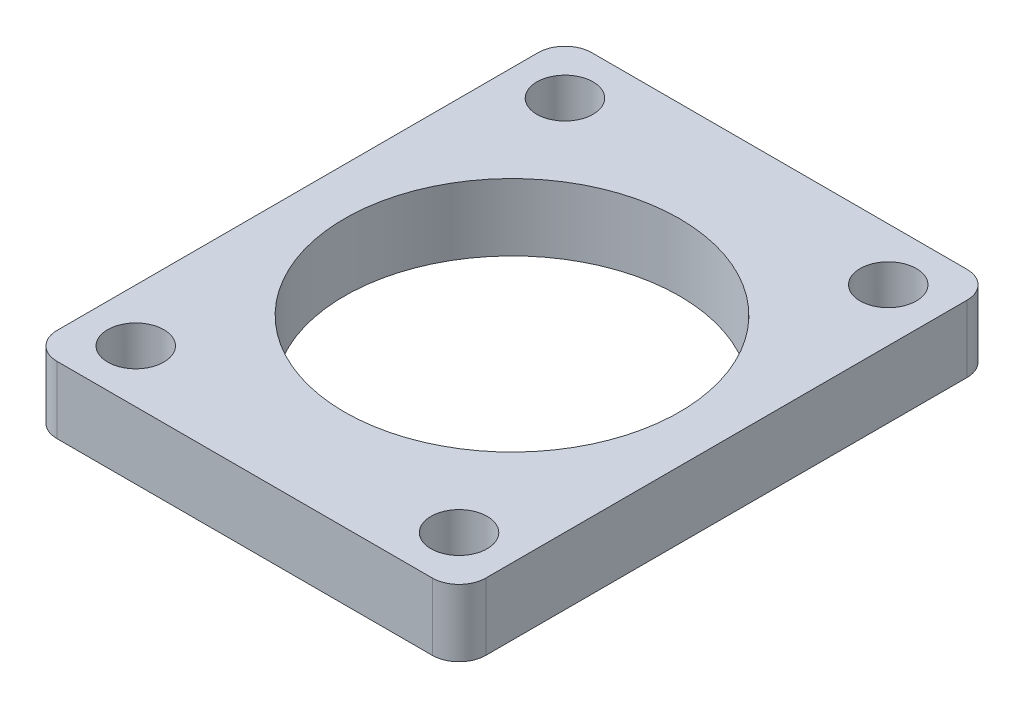
ISO-10303-21;
HEADER;
FILE_DESCRIPTION(('STEP AP214'),'2;1');
FILE_NAME('part.step','',(''),(''),'','','');
FILE_SCHEMA(('AUTOMOTIVE_DESIGN { 1 0 10303 214 1 1 1 1 }'));
ENDSEC;
DATA;
#1=APPLICATION_CONTEXT('core data for automotive mechanical design processes');
#2=APPLICATION_PROTOCOL_DEFINITION('international standard','automotive_design',2000,#1);
#3=PRODUCT_CONTEXT('',#1,'mechanical');
#4=PRODUCT('Part','Part','',(#3));
#5=PRODUCT_RELATED_PRODUCT_CATEGORY('part','',(#4));
#6=PRODUCT_DEFINITION_FORMATION('','',#4);
#7=PRODUCT_DEFINITION_CONTEXT('part definition',#1,'design');
#8=PRODUCT_DEFINITION('design','',#6,#7);
#9=PRODUCT_DEFINITION_SHAPE('','',#8);
#10=(LENGTH_UNIT() NAMED_UNIT(*) SI_UNIT(.MILLI.,.METRE.));
#11=(NAMED_UNIT(*) PLANE_ANGLE_UNIT() SI_UNIT($,.RADIAN.));
#12=(NAMED_UNIT(*) SI_UNIT($,.STERADIAN.) SOLID_ANGLE_UNIT());
#13=UNCERTAINTY_MEASURE_WITH_UNIT(LENGTH_MEASURE(1.E-05),#10,'distance_accuracy_value','');
#14=(GEOMETRIC_REPRESENTATION_CONTEXT(3) GLOBAL_UNCERTAINTY_ASSIGNED_CONTEXT((#13)) GLOBAL_UNIT_ASSIGNED_CONTEXT((#10,
#11,#12)) REPRESENTATION_CONTEXT('',''));
#15=CARTESIAN_POINT('',(0.,0.,0.));
#16=DIRECTION('',(0.,0.,1.));
#17=DIRECTION('',(1.,0.,0.));
#18=AXIS2_PLACEMENT_3D('',#15,#16,#17);
#19=CARTESIAN_POINT('',(0.,6.35000000000002,0.));
#20=DIRECTION('',(0.,1.,0.));
#21=DIRECTION('',(0.,0.,1.));
#22=AXIS2_PLACEMENT_3D('',#19,#20,#21);
#23=PLANE('',#22);
#24=CARTESIAN_POINT('',(-15.32,6.35000000000002,20.3365));
#25=DIRECTION('',(0.,1.,0.));
#26=DIRECTION('',(0.,0.,-1.));
#27=AXIS2_PLACEMENT_3D('',#24,#25,#26);
#28=CIRCLE('',#27,2.665);
#29=CARTESIAN_POINT('',(-15.32,6.35000000000002,17.6715));
#30=VERTEX_POINT('',#29);
#31=EDGE_CURVE('E210',#30,#30,#28,.T.);
#32=ORIENTED_EDGE('',*,*,#31,.F.);
#33=EDGE_LOOP('',(#32));
#34=FACE_BOUND('',#33,.T.);
#35=CARTESIAN_POINT('',(15.32,6.35000000000002,20.3365));
#36=DIRECTION('',(0.,1.,0.));
#37=DIRECTION('',(0.,0.,1.));
#38=AXIS2_PLACEMENT_3D('',#35,#36,#37);
#39=CIRCLE('',#38,2.665);
#40=CARTESIAN_POINT('',(15.32,6.35000000000002,23.0015));
#41=VERTEX_POINT('',#40);
#42=EDGE_CURVE('E209',#41,#41,#39,.T.);
#43=ORIENTED_EDGE('',*,*,#42,.F.);
#44=EDGE_LOOP('',(#43));
#45=FACE_BOUND('',#44,.T.);
#46=CARTESIAN_POINT('',(15.32,6.35000000000002,-20.3365));
#47=DIRECTION('',(0.,1.,0.));
#48=DIRECTION('',(0.,0.,-1.));
#49=AXIS2_PLACEMENT_3D('',#46,#47,#48);
#50=CIRCLE('',#49,2.665);
#51=CARTESIAN_POINT('',(15.32,6.35000000000002,-23.0015));
#52=VERTEX_POINT('',#51);
#53=EDGE_CURVE('E216',#52,#52,#50,.T.);
#54=ORIENTED_EDGE('',*,*,#53,.F.);
#55=EDGE_LOOP('',(#54));
#56=FACE_BOUND('',#55,.T.);
#57=CARTESIAN_POINT('',(-15.32,6.35000000000002,-20.3365));
#58=DIRECTION('',(0.,1.,0.));
#59=DIRECTION('',(0.,0.,1.));
#60=AXIS2_PLACEMENT_3D('',#57,#58,#59);
#61=CIRCLE('',#60,2.665);
#62=CARTESIAN_POINT('',(-15.32,6.35000000000002,-17.6715));
#63=VERTEX_POINT('',#62);
#64=EDGE_CURVE('E202',#63,#63,#61,.T.);
#65=ORIENTED_EDGE('',*,*,#64,.F.);
#66=EDGE_LOOP('',(#65));
#67=FACE_BOUND('',#66,.T.);
#68=DIRECTION('',(0.,0.,-1.));
#69=VECTOR('',#68,1.);
#70=CARTESIAN_POINT('',(20.32,6.35000000000002,-25.3365));
#71=LINE('',#70,#69);
#72=CARTESIAN_POINT('',(20.32,6.35000000000002,22.7965));
#73=VERTEX_POINT('',#72);
#74=CARTESIAN_POINT('',(20.32,6.35000000000002,-22.7965));
#75=VERTEX_POINT('',#74);
#76=EDGE_CURVE('E149',#73,#75,#71,.T.);
#77=ORIENTED_EDGE('',*,*,#76,.T.);
#78=CARTESIAN_POINT('',(17.78,6.35000000000002,-22.7965));
#79=DIRECTION('',(0.,1.,0.));
#80=DIRECTION('',(0.,0.,1.));
#81=AXIS2_PLACEMENT_3D('',#78,#79,#80);
#82=CIRCLE('',#81,2.54);
#83=CARTESIAN_POINT('',(17.78,6.35000000000002,-25.3365));
#84=VERTEX_POINT('',#83);
#85=EDGE_CURVE('E164',#75,#84,#82,.T.);
#86=ORIENTED_EDGE('',*,*,#85,.T.);
#87=DIRECTION('',(-1.,0.,0.));
#88=VECTOR('',#87,1.);
#89=CARTESIAN_POINT('',(-20.32,6.35000000000002,-25.3365));
#90=LINE('',#89,#88);
#91=CARTESIAN_POINT('',(-17.78,6.35000000000002,-25.3365));
#92=VERTEX_POINT('',#91);
#93=EDGE_CURVE('E131',#84,#92,#90,.T.);
#94=ORIENTED_EDGE('',*,*,#93,.T.);
#95=CARTESIAN_POINT('',(-17.78,6.35000000000002,-22.7965));
#96=DIRECTION('',(0.,1.,0.));
#97=DIRECTION('',(0.,0.,1.));
#98=AXIS2_PLACEMENT_3D('',#95,#96,#97);
#99=CIRCLE('',#98,2.54);
#100=CARTESIAN_POINT('',(-20.32,6.35000000000002,-22.7965));
#101=VERTEX_POINT('',#100);
#102=EDGE_CURVE('E162',#92,#101,#99,.T.);
#103=ORIENTED_EDGE('',*,*,#102,.T.);
#104=DIRECTION('',(0.,0.,1.));
#105=VECTOR('',#104,1.);
#106=CARTESIAN_POINT('',(-20.32,6.35000000000002,-25.3365));
#107=LINE('',#106,#105);
#108=CARTESIAN_POINT('',(-20.32,6.35000000000002,22.7965));
#109=VERTEX_POINT('',#108);
#110=EDGE_CURVE('E184',#101,#109,#107,.T.);
#111=ORIENTED_EDGE('',*,*,#110,.T.);
#112=CARTESIAN_POINT('',(-17.78,6.35000000000002,22.7965));
#113=DIRECTION('',(0.,1.,0.));
#114=DIRECTION('',(0.,0.,1.));
#115=AXIS2_PLACEMENT_3D('',#112,#113,#114);
#116=CIRCLE('',#115,2.54);
#117=CARTESIAN_POINT('',(-17.78,6.35000000000002,25.3365));
#118=VERTEX_POINT('',#117);
#119=EDGE_CURVE('E66',#109,#118,#116,.T.);
#120=ORIENTED_EDGE('',*,*,#119,.T.);
#121=DIRECTION('',(1.,0.,0.));
#122=VECTOR('',#121,1.);
#123=CARTESIAN_POINT('',(-20.32,6.35000000000002,25.3365));
#124=LINE('',#123,#122);
#125=CARTESIAN_POINT('',(17.78,6.35000000000002,25.3365));
#126=VERTEX_POINT('',#125);
#127=EDGE_CURVE('E150',#118,#126,#124,.T.);
#128=ORIENTED_EDGE('',*,*,#127,.T.);
#129=CARTESIAN_POINT('',(17.78,6.35000000000002,22.7965));
#130=DIRECTION('',(0.,1.,0.));
#131=DIRECTION('',(0.,0.,1.));
#132=AXIS2_PLACEMENT_3D('',#129,#130,#131);
#133=CIRCLE('',#132,2.54);
#134=EDGE_CURVE('E160',#126,#73,#133,.T.);
#135=ORIENTED_EDGE('',*,*,#134,.T.);
#136=EDGE_LOOP('',(#77,#86,#94,#103,#111,#120,#128,#135));
#137=FACE_BOUND('',#136,.T.);
#138=CARTESIAN_POINT('',(0.,6.35000000000002,0.));
#139=DIRECTION('',(0.,1.,0.));
#140=DIRECTION('',(0.,0.,1.));
#141=AXIS2_PLACEMENT_3D('',#138,#139,#140);
#142=CIRCLE('',#141,15.875);
#143=CARTESIAN_POINT('',(0.,6.35000000000002,15.875));
#144=VERTEX_POINT('',#143);
#145=EDGE_CURVE('E144',#144,#144,#142,.T.);
#146=ORIENTED_EDGE('',*,*,#145,.F.);
#147=EDGE_LOOP('',(#146));
#148=FACE_BOUND('',#147,.T.);
#149=ADVANCED_FACE('F46',(#34,#45,#56,#67,#137,#148),#23,.T.);
#150=CARTESIAN_POINT('',(0.,0.,0.));
#151=DIRECTION('',(0.,1.,0.));
#152=DIRECTION('',(0.,0.,1.));
#153=AXIS2_PLACEMENT_3D('',#150,#151,#152);
#154=PLANE('',#153);
#155=CARTESIAN_POINT('',(-15.32,0.,20.3365));
#156=DIRECTION('',(0.,1.,0.));
#157=DIRECTION('',(0.,0.,1.));
#158=AXIS2_PLACEMENT_3D('',#155,#156,#157);
#159=CIRCLE('',#158,2.665);
#160=CARTESIAN_POINT('',(-15.32,0.,23.0015));
#161=VERTEX_POINT('',#160);
#162=EDGE_CURVE('E206',#161,#161,#159,.F.);
#163=ORIENTED_EDGE('',*,*,#162,.F.);
#164=EDGE_LOOP('',(#163));
#165=FACE_BOUND('',#164,.T.);
#166=CARTESIAN_POINT('',(15.32,0.,20.3365));
#167=DIRECTION('',(0.,1.,0.));
#168=DIRECTION('',(0.,0.,1.));
#169=AXIS2_PLACEMENT_3D('',#166,#167,#168);
#170=CIRCLE('',#169,2.665);
#171=CARTESIAN_POINT('',(15.32,0.,23.0015));
#172=VERTEX_POINT('',#171);
#173=EDGE_CURVE('E213',#172,#172,#170,.F.);
#174=ORIENTED_EDGE('',*,*,#173,.F.);
#175=EDGE_LOOP('',(#174));
#176=FACE_BOUND('',#175,.T.);
#177=CARTESIAN_POINT('',(15.32,0.,-20.3365));
#178=DIRECTION('',(0.,1.,0.));
#179=DIRECTION('',(0.,0.,1.));
#180=AXIS2_PLACEMENT_3D('',#177,#178,#179);
#181=CIRCLE('',#180,2.665);
#182=CARTESIAN_POINT('',(15.32,0.,-17.6715));
#183=VERTEX_POINT('',#182);
#184=EDGE_CURVE('E205',#183,#183,#181,.F.);
#185=ORIENTED_EDGE('',*,*,#184,.F.);
#186=EDGE_LOOP('',(#185));
#187=FACE_BOUND('',#186,.T.);
#188=CARTESIAN_POINT('',(-15.32,0.,-20.3365));
#189=DIRECTION('',(0.,1.,0.));
#190=DIRECTION('',(0.,0.,1.));
#191=AXIS2_PLACEMENT_3D('',#188,#189,#190);
#192=CIRCLE('',#191,2.665);
#193=CARTESIAN_POINT('',(-15.32,0.,-17.6715));
#194=VERTEX_POINT('',#193);
#195=EDGE_CURVE('E198',#194,#194,#192,.F.);
#196=ORIENTED_EDGE('',*,*,#195,.F.);
#197=EDGE_LOOP('',(#196));
#198=FACE_BOUND('',#197,.T.);
#199=DIRECTION('',(-1.,0.,0.));
#200=VECTOR('',#199,1.);
#201=CARTESIAN_POINT('',(-20.32,0.,-25.3365));
#202=LINE('',#201,#200);
#203=CARTESIAN_POINT('',(17.78,0.,-25.3365));
#204=VERTEX_POINT('',#203);
#205=CARTESIAN_POINT('',(-17.78,0.,-25.3365));
#206=VERTEX_POINT('',#205);
#207=EDGE_CURVE('E128',#204,#206,#202,.T.);
#208=ORIENTED_EDGE('',*,*,#207,.F.);
#209=CARTESIAN_POINT('',(17.78,0.,-22.7965));
#210=DIRECTION('',(0.,1.,0.));
#211=DIRECTION('',(0.,0.,1.));
#212=AXIS2_PLACEMENT_3D('',#209,#210,#211);
#213=CIRCLE('',#212,2.54);
#214=CARTESIAN_POINT('',(20.32,0.,-22.7965));
#215=VERTEX_POINT('',#214);
#216=EDGE_CURVE('E111',#204,#215,#213,.F.);
#217=ORIENTED_EDGE('',*,*,#216,.T.);
#218=DIRECTION('',(0.,0.,-1.));
#219=VECTOR('',#218,1.);
#220=CARTESIAN_POINT('',(20.32,0.,-25.3365));
#221=LINE('',#220,#219);
#222=CARTESIAN_POINT('',(20.32,0.,22.7965));
#223=VERTEX_POINT('',#222);
#224=EDGE_CURVE('E139',#223,#215,#221,.T.);
#225=ORIENTED_EDGE('',*,*,#224,.F.);
#226=CARTESIAN_POINT('',(17.78,0.,22.7965));
#227=DIRECTION('',(0.,1.,0.));
#228=DIRECTION('',(0.,0.,1.));
#229=AXIS2_PLACEMENT_3D('',#226,#227,#228);
#230=CIRCLE('',#229,2.54);
#231=CARTESIAN_POINT('',(17.78,0.,25.3365));
#232=VERTEX_POINT('',#231);
#233=EDGE_CURVE('E153',#223,#232,#230,.F.);
#234=ORIENTED_EDGE('',*,*,#233,.T.);
#235=DIRECTION('',(1.,0.,0.));
#236=VECTOR('',#235,1.);
#237=CARTESIAN_POINT('',(-20.32,0.,25.3365));
#238=LINE('',#237,#236);
#239=CARTESIAN_POINT('',(-17.78,0.,25.3365));
#240=VERTEX_POINT('',#239);
#241=EDGE_CURVE('E142',#240,#232,#238,.T.);
#242=ORIENTED_EDGE('',*,*,#241,.F.);
#243=CARTESIAN_POINT('',(-17.78,0.,22.7965));
#244=DIRECTION('',(0.,1.,0.));
#245=DIRECTION('',(0.,0.,1.));
#246=AXIS2_PLACEMENT_3D('',#243,#244,#245);
#247=CIRCLE('',#246,2.54);
#248=CARTESIAN_POINT('',(-20.32,0.,22.7965));
#249=VERTEX_POINT('',#248);
#250=EDGE_CURVE('E132',#240,#249,#247,.F.);
#251=ORIENTED_EDGE('',*,*,#250,.T.);
#252=DIRECTION('',(0.,0.,1.));
#253=VECTOR('',#252,1.);
#254=CARTESIAN_POINT('',(-20.32,0.,-25.3365));
#255=LINE('',#254,#253);
#256=CARTESIAN_POINT('',(-20.32,0.,-22.7965));
#257=VERTEX_POINT('',#256);
#258=EDGE_CURVE('E138',#257,#249,#255,.T.);
#259=ORIENTED_EDGE('',*,*,#258,.F.);
#260=CARTESIAN_POINT('',(-17.78,0.,-22.7965));
#261=DIRECTION('',(0.,1.,0.));
#262=DIRECTION('',(0.,0.,1.));
#263=AXIS2_PLACEMENT_3D('',#260,#261,#262);
#264=CIRCLE('',#263,2.54);
#265=EDGE_CURVE('E122',#257,#206,#264,.F.);
#266=ORIENTED_EDGE('',*,*,#265,.T.);
#267=EDGE_LOOP('',(#208,#217,#225,#234,#242,#251,#259,#266));
#268=FACE_BOUND('',#267,.T.);
#269=CARTESIAN_POINT('',(0.,0.,0.));
#270=DIRECTION('',(0.,1.,0.));
#271=DIRECTION('',(0.,0.,1.));
#272=AXIS2_PLACEMENT_3D('',#269,#270,#271);
#273=CIRCLE('',#272,15.875);
#274=CARTESIAN_POINT('',(0.,0.,15.875));
#275=VERTEX_POINT('',#274);
#276=EDGE_CURVE('E187',#275,#275,#273,.T.);
#277=ORIENTED_EDGE('',*,*,#276,.T.);
#278=EDGE_LOOP('',(#277));
#279=FACE_BOUND('',#278,.T.);
#280=ADVANCED_FACE('F135',(#165,#176,#187,#198,#268,#279),#154,.F.);
#281=CARTESIAN_POINT('',(20.32,6.35000000000002,-25.3365));
#282=DIRECTION('',(-1.,0.,0.));
#283=DIRECTION('',(0.,0.,1.));
#284=AXIS2_PLACEMENT_3D('',#281,#282,#283);
#285=PLANE('',#284);
#286=ORIENTED_EDGE('',*,*,#224,.T.);
#287=DIRECTION('',(0.,-1.,0.));
#288=VECTOR('',#287,1.);
#289=CARTESIAN_POINT('',(20.32,6.35000000000002,-22.7965));
#290=LINE('',#289,#288);
#291=EDGE_CURVE('E116',#215,#75,#290,.F.);
#292=ORIENTED_EDGE('',*,*,#291,.T.);
#293=ORIENTED_EDGE('',*,*,#76,.F.);
#294=DIRECTION('',(0.,-1.,0.));
#295=VECTOR('',#294,1.);
#296=CARTESIAN_POINT('',(20.32,6.35000000000002,22.7965));
#297=LINE('',#296,#295);
#298=EDGE_CURVE('E121',#73,#223,#297,.T.);
#299=ORIENTED_EDGE('',*,*,#298,.T.);
#300=EDGE_LOOP('',(#286,#292,#293,#299));
#301=FACE_BOUND('',#300,.T.);
#302=ADVANCED_FACE('F181',(#301),#285,.F.);
#303=CARTESIAN_POINT('',(-20.32,6.35000000000002,-25.3365));
#304=DIRECTION('',(0.,0.,1.));
#305=DIRECTION('',(1.,0.,0.));
#306=AXIS2_PLACEMENT_3D('',#303,#304,#305);
#307=PLANE('',#306);
#308=ORIENTED_EDGE('',*,*,#93,.F.);
#309=DIRECTION('',(0.,-1.,0.));
#310=VECTOR('',#309,1.);
#311=CARTESIAN_POINT('',(17.78,6.35000000000002,-25.3365));
#312=LINE('',#311,#310);
#313=EDGE_CURVE('E115',#84,#204,#312,.T.);
#314=ORIENTED_EDGE('',*,*,#313,.T.);
#315=ORIENTED_EDGE('',*,*,#207,.T.);
#316=DIRECTION('',(0.,-1.,0.));
#317=VECTOR('',#316,1.);
#318=CARTESIAN_POINT('',(-17.78,6.35000000000002,-25.3365));
#319=LINE('',#318,#317);
#320=EDGE_CURVE('E133',#206,#92,#319,.F.);
#321=ORIENTED_EDGE('',*,*,#320,.T.);
#322=EDGE_LOOP('',(#308,#314,#315,#321));
#323=FACE_BOUND('',#322,.T.);
#324=ADVANCED_FACE('F127',(#323),#307,.F.);
#325=CARTESIAN_POINT('',(-20.32,6.35000000000002,-25.3365));
#326=DIRECTION('',(1.,0.,0.));
#327=DIRECTION('',(0.,0.,-1.));
#328=AXIS2_PLACEMENT_3D('',#325,#326,#327);
#329=PLANE('',#328);
#330=ORIENTED_EDGE('',*,*,#110,.F.);
#331=DIRECTION('',(0.,-1.,0.));
#332=VECTOR('',#331,1.);
#333=CARTESIAN_POINT('',(-20.32,6.35000000000002,-22.7965));
#334=LINE('',#333,#332);
#335=EDGE_CURVE('E168',#101,#257,#334,.T.);
#336=ORIENTED_EDGE('',*,*,#335,.T.);
#337=ORIENTED_EDGE('',*,*,#258,.T.);
#338=DIRECTION('',(0.,-1.,0.));
#339=VECTOR('',#338,1.);
#340=CARTESIAN_POINT('',(-20.32,6.35000000000002,22.7965));
#341=LINE('',#340,#339);
#342=EDGE_CURVE('E166',#249,#109,#341,.F.);
#343=ORIENTED_EDGE('',*,*,#342,.T.);
#344=EDGE_LOOP('',(#330,#336,#337,#343));
#345=FACE_BOUND('',#344,.T.);
#346=ADVANCED_FACE('F250',(#345),#329,.F.);
#347=CARTESIAN_POINT('',(-20.32,6.35000000000002,25.3365));
#348=DIRECTION('',(0.,0.,-1.));
#349=DIRECTION('',(-1.,0.,0.));
#350=AXIS2_PLACEMENT_3D('',#347,#348,#349);
#351=PLANE('',#350);
#352=ORIENTED_EDGE('',*,*,#241,.T.);
#353=DIRECTION('',(0.,-1.,0.));
#354=VECTOR('',#353,1.);
#355=CARTESIAN_POINT('',(17.78,6.35000000000002,25.3365));
#356=LINE('',#355,#354);
#357=EDGE_CURVE('E13',#232,#126,#356,.F.);
#358=ORIENTED_EDGE('',*,*,#357,.T.);
#359=ORIENTED_EDGE('',*,*,#127,.F.);
#360=DIRECTION('',(0.,-1.,0.));
#361=VECTOR('',#360,1.);
#362=CARTESIAN_POINT('',(-17.78,6.35000000000002,25.3365));
#363=LINE('',#362,#361);
#364=EDGE_CURVE('E54',#118,#240,#363,.T.);
#365=ORIENTED_EDGE('',*,*,#364,.T.);
#366=EDGE_LOOP('',(#352,#358,#359,#365));
#367=FACE_BOUND('',#366,.T.);
#368=ADVANCED_FACE('F173',(#367),#351,.F.);
#369=CARTESIAN_POINT('',(0.,6.35000000000002,0.));
#370=DIRECTION('',(0.,-1.,0.));
#371=DIRECTION('',(0.,0.,-1.));
#372=AXIS2_PLACEMENT_3D('',#369,#370,#371);
#373=CYLINDRICAL_SURFACE('',#372,15.875);
#374=ORIENTED_EDGE('',*,*,#145,.T.);
#375=EDGE_LOOP('',(#374));
#376=FACE_BOUND('',#375,.T.);
#377=ORIENTED_EDGE('',*,*,#276,.F.);
#378=EDGE_LOOP('',(#377));
#379=FACE_BOUND('',#378,.T.);
#380=ADVANCED_FACE('F233',(#376,#379),#373,.F.);
#381=CARTESIAN_POINT('',(-15.32,-0.000999999999973245,-20.3365));
#382=DIRECTION('',(0.,1.,0.));
#383=DIRECTION('',(0.,0.,1.));
#384=AXIS2_PLACEMENT_3D('',#381,#382,#383);
#385=CYLINDRICAL_SURFACE('',#384,2.665);
#386=ORIENTED_EDGE('',*,*,#64,.T.);
#387=EDGE_LOOP('',(#386));
#388=FACE_BOUND('',#387,.T.);
#389=ORIENTED_EDGE('',*,*,#195,.T.);
#390=EDGE_LOOP('',(#389));
#391=FACE_BOUND('',#390,.T.);
#392=ADVANCED_FACE('F230',(#388,#391),#385,.F.);
#393=CARTESIAN_POINT('',(15.32,-0.000999999999973245,-20.3365));
#394=DIRECTION('',(0.,1.,0.));
#395=DIRECTION('',(0.,0.,1.));
#396=AXIS2_PLACEMENT_3D('',#393,#394,#395);
#397=CYLINDRICAL_SURFACE('',#396,2.665);
#398=ORIENTED_EDGE('',*,*,#53,.T.);
#399=EDGE_LOOP('',(#398));
#400=FACE_BOUND('',#399,.T.);
#401=ORIENTED_EDGE('',*,*,#184,.T.);
#402=EDGE_LOOP('',(#401));
#403=FACE_BOUND('',#402,.T.);
#404=ADVANCED_FACE('F224',(#400,#403),#397,.F.);
#405=CARTESIAN_POINT('',(15.32,-0.000999999999973245,20.3365));
#406=DIRECTION('',(0.,1.,0.));
#407=DIRECTION('',(0.,0.,1.));
#408=AXIS2_PLACEMENT_3D('',#405,#406,#407);
#409=CYLINDRICAL_SURFACE('',#408,2.665);
#410=ORIENTED_EDGE('',*,*,#42,.T.);
#411=EDGE_LOOP('',(#410));
#412=FACE_BOUND('',#411,.T.);
#413=ORIENTED_EDGE('',*,*,#173,.T.);
#414=EDGE_LOOP('',(#413));
#415=FACE_BOUND('',#414,.T.);
#416=ADVANCED_FACE('F297',(#412,#415),#409,.F.);
#417=CARTESIAN_POINT('',(-15.32,-0.000999999999973245,20.3365));
#418=DIRECTION('',(0.,1.,0.));
#419=DIRECTION('',(0.,0.,1.));
#420=AXIS2_PLACEMENT_3D('',#417,#418,#419);
#421=CYLINDRICAL_SURFACE('',#420,2.665);
#422=ORIENTED_EDGE('',*,*,#31,.T.);
#423=EDGE_LOOP('',(#422));
#424=FACE_BOUND('',#423,.T.);
#425=ORIENTED_EDGE('',*,*,#162,.T.);
#426=EDGE_LOOP('',(#425));
#427=FACE_BOUND('',#426,.T.);
#428=ADVANCED_FACE('F259',(#424,#427),#421,.F.);
#429=CARTESIAN_POINT('',(17.78,6.35000000000002,-22.7965));
#430=DIRECTION('',(0.,-1.,0.));
#431=DIRECTION('',(0.,0.,-1.));
#432=AXIS2_PLACEMENT_3D('',#429,#430,#431);
#433=CYLINDRICAL_SURFACE('',#432,2.54);
#434=ORIENTED_EDGE('',*,*,#85,.F.);
#435=ORIENTED_EDGE('',*,*,#291,.F.);
#436=ORIENTED_EDGE('',*,*,#216,.F.);
#437=ORIENTED_EDGE('',*,*,#313,.F.);
#438=EDGE_LOOP('',(#434,#435,#436,#437));
#439=FACE_BOUND('',#438,.T.);
#440=ADVANCED_FACE('F114',(#439),#433,.T.);
#441=CARTESIAN_POINT('',(-17.78,6.35000000000002,-22.7965));
#442=DIRECTION('',(0.,-1.,0.));
#443=DIRECTION('',(0.,0.,-1.));
#444=AXIS2_PLACEMENT_3D('',#441,#442,#443);
#445=CYLINDRICAL_SURFACE('',#444,2.54);
#446=ORIENTED_EDGE('',*,*,#102,.F.);
#447=ORIENTED_EDGE('',*,*,#320,.F.);
#448=ORIENTED_EDGE('',*,*,#265,.F.);
#449=ORIENTED_EDGE('',*,*,#335,.F.);
#450=EDGE_LOOP('',(#446,#447,#448,#449));
#451=FACE_BOUND('',#450,.T.);
#452=ADVANCED_FACE('F258',(#451),#445,.T.);
#453=CARTESIAN_POINT('',(17.78,6.35000000000002,22.7965));
#454=DIRECTION('',(0.,-1.,0.));
#455=DIRECTION('',(0.,0.,-1.));
#456=AXIS2_PLACEMENT_3D('',#453,#454,#455);
#457=CYLINDRICAL_SURFACE('',#456,2.54);
#458=ORIENTED_EDGE('',*,*,#134,.F.);
#459=ORIENTED_EDGE('',*,*,#357,.F.);
#460=ORIENTED_EDGE('',*,*,#233,.F.);
#461=ORIENTED_EDGE('',*,*,#298,.F.);
#462=EDGE_LOOP('',(#458,#459,#460,#461));
#463=FACE_BOUND('',#462,.T.);
#464=ADVANCED_FACE('F178',(#463),#457,.T.);
#465=CARTESIAN_POINT('',(-17.78,6.35000000000002,22.7965));
#466=DIRECTION('',(0.,-1.,0.));
#467=DIRECTION('',(0.,0.,-1.));
#468=AXIS2_PLACEMENT_3D('',#465,#466,#467);
#469=CYLINDRICAL_SURFACE('',#468,2.54);
#470=ORIENTED_EDGE('',*,*,#119,.F.);
#471=ORIENTED_EDGE('',*,*,#342,.F.);
#472=ORIENTED_EDGE('',*,*,#250,.F.);
#473=ORIENTED_EDGE('',*,*,#364,.F.);
#474=EDGE_LOOP('',(#470,#471,#472,#473));
#475=FACE_BOUND('',#474,.T.);
#476=ADVANCED_FACE('F48',(#475),#469,.T.);
#477=CLOSED_SHELL('',(#149,#280,#302,#324,#346,#368,#380,#392,#404,#416,#428,#440,#452,#464,#476));
#478=MANIFOLD_SOLID_BREP('B2',#477);
#479=ADVANCED_BREP_SHAPE_REPRESENTATION('',(#18,#478),#14);
#480=SHAPE_DEFINITION_REPRESENTATION(#9,#479);
ENDSEC;
END-ISO-10303-21;
